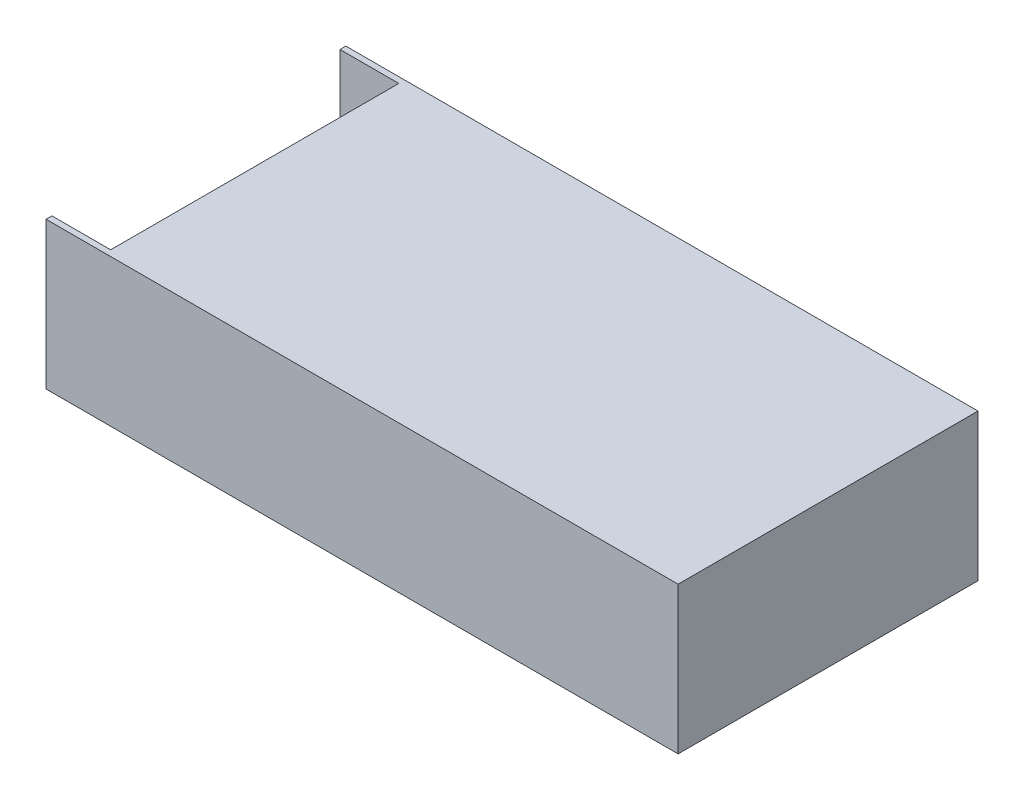
ISO-10303-21;
HEADER;
FILE_DESCRIPTION(('STEP AP214'),'2;1');
FILE_NAME('part.step','',(''),(''),'','','');
FILE_SCHEMA(('AUTOMOTIVE_DESIGN { 1 0 10303 214 1 1 1 1 }'));
ENDSEC;
DATA;
#1=APPLICATION_CONTEXT('core data for automotive mechanical design processes');
#2=APPLICATION_PROTOCOL_DEFINITION('international standard','automotive_design',2000,#1);
#3=PRODUCT_CONTEXT('',#1,'mechanical');
#4=PRODUCT('Part','Part','',(#3));
#5=PRODUCT_RELATED_PRODUCT_CATEGORY('part','',(#4));
#6=PRODUCT_DEFINITION_FORMATION('','',#4);
#7=PRODUCT_DEFINITION_CONTEXT('part definition',#1,'design');
#8=PRODUCT_DEFINITION('design','',#6,#7);
#9=PRODUCT_DEFINITION_SHAPE('','',#8);
#10=(LENGTH_UNIT() NAMED_UNIT(*) SI_UNIT(.MILLI.,.METRE.));
#11=(NAMED_UNIT(*) PLANE_ANGLE_UNIT() SI_UNIT($,.RADIAN.));
#12=(NAMED_UNIT(*) SI_UNIT($,.STERADIAN.) SOLID_ANGLE_UNIT());
#13=UNCERTAINTY_MEASURE_WITH_UNIT(LENGTH_MEASURE(1.E-05),#10,'distance_accuracy_value','');
#14=(GEOMETRIC_REPRESENTATION_CONTEXT(3) GLOBAL_UNCERTAINTY_ASSIGNED_CONTEXT((#13)) GLOBAL_UNIT_ASSIGNED_CONTEXT((#10,
#11,#12)) REPRESENTATION_CONTEXT('',''));
#15=CARTESIAN_POINT('',(0.,0.,0.));
#16=DIRECTION('',(0.,0.,1.));
#17=DIRECTION('',(1.,0.,0.));
#18=AXIS2_PLACEMENT_3D('',#15,#16,#17);
#19=CARTESIAN_POINT('',(0.,50.,0.));
#20=DIRECTION('',(1.,0.,0.));
#21=DIRECTION('',(0.,0.,-1.));
#22=AXIS2_PLACEMENT_3D('',#19,#20,#21);
#23=PLANE('',#22);
#24=DIRECTION('',(0.,0.,1.));
#25=VECTOR('',#24,1.);
#26=CARTESIAN_POINT('',(0.,25.,-100.));
#27=LINE('',#26,#25);
#28=CARTESIAN_POINT('',(0.,25.,-100.));
#29=VERTEX_POINT('',#28);
#30=CARTESIAN_POINT('',(0.,25.,-2.));
#31=VERTEX_POINT('',#30);
#32=EDGE_CURVE('E113',#29,#31,#27,.T.);
#33=ORIENTED_EDGE('',*,*,#32,.F.);
#34=DIRECTION('',(0.,1.,0.));
#35=VECTOR('',#34,1.);
#36=CARTESIAN_POINT('',(0.,25.,-100.));
#37=LINE('',#36,#35);
#38=CARTESIAN_POINT('',(0.,50.,-100.));
#39=VERTEX_POINT('',#38);
#40=EDGE_CURVE('E143',#29,#39,#37,.T.);
#41=ORIENTED_EDGE('',*,*,#40,.T.);
#42=DIRECTION('',(0.,0.,1.));
#43=VECTOR('',#42,1.);
#44=CARTESIAN_POINT('',(0.,50.,0.));
#45=LINE('',#44,#43);
#46=CARTESIAN_POINT('',(0.,50.,-102.));
#47=VERTEX_POINT('',#46);
#48=EDGE_CURVE('E131',#47,#39,#45,.T.);
#49=ORIENTED_EDGE('',*,*,#48,.F.);
#50=DIRECTION('',(0.,-1.,0.));
#51=VECTOR('',#50,1.);
#52=CARTESIAN_POINT('',(0.,50.,-102.));
#53=LINE('',#52,#51);
#54=CARTESIAN_POINT('',(0.,0.,-102.));
#55=VERTEX_POINT('',#54);
#56=EDGE_CURVE('E138',#47,#55,#53,.T.);
#57=ORIENTED_EDGE('',*,*,#56,.T.);
#58=DIRECTION('',(0.,0.,1.));
#59=VECTOR('',#58,1.);
#60=CARTESIAN_POINT('',(0.,0.,0.));
#61=LINE('',#60,#59);
#62=CARTESIAN_POINT('',(0.,0.,0.));
#63=VERTEX_POINT('',#62);
#64=EDGE_CURVE('E139',#55,#63,#61,.T.);
#65=ORIENTED_EDGE('',*,*,#64,.T.);
#66=DIRECTION('',(0.,-1.,0.));
#67=VECTOR('',#66,1.);
#68=CARTESIAN_POINT('',(0.,50.,0.));
#69=LINE('',#68,#67);
#70=CARTESIAN_POINT('',(0.,50.,0.));
#71=VERTEX_POINT('',#70);
#72=EDGE_CURVE('E11',#71,#63,#69,.T.);
#73=ORIENTED_EDGE('',*,*,#72,.F.);
#74=CARTESIAN_POINT('',(0.,50.,-2.));
#75=VERTEX_POINT('',#74);
#76=EDGE_CURVE('E83',#75,#71,#45,.T.);
#77=ORIENTED_EDGE('',*,*,#76,.F.);
#78=DIRECTION('',(0.,1.,0.));
#79=VECTOR('',#78,1.);
#80=CARTESIAN_POINT('',(0.,25.,-2.));
#81=LINE('',#80,#79);
#82=EDGE_CURVE('E47',#31,#75,#81,.T.);
#83=ORIENTED_EDGE('',*,*,#82,.F.);
#84=EDGE_LOOP('',(#33,#41,#49,#57,#65,#73,#77,#83));
#85=FACE_BOUND('',#84,.T.);
#86=ADVANCED_FACE('F33',(#85),#23,.F.);
#87=CARTESIAN_POINT('',(0.,50.,0.));
#88=DIRECTION('',(0.,0.,-1.));
#89=DIRECTION('',(-1.,0.,0.));
#90=AXIS2_PLACEMENT_3D('',#87,#88,#89);
#91=PLANE('',#90);
#92=DIRECTION('',(1.,0.,0.));
#93=VECTOR('',#92,1.);
#94=CARTESIAN_POINT('',(0.,0.,0.));
#95=LINE('',#94,#93);
#96=CARTESIAN_POINT('',(215.,0.,0.));
#97=VERTEX_POINT('',#96);
#98=EDGE_CURVE('E142',#63,#97,#95,.T.);
#99=ORIENTED_EDGE('',*,*,#98,.T.);
#100=DIRECTION('',(0.,-1.,0.));
#101=VECTOR('',#100,1.);
#102=CARTESIAN_POINT('',(215.,50.,0.));
#103=LINE('',#102,#101);
#104=CARTESIAN_POINT('',(215.,50.,0.));
#105=VERTEX_POINT('',#104);
#106=EDGE_CURVE('E40',#105,#97,#103,.T.);
#107=ORIENTED_EDGE('',*,*,#106,.F.);
#108=DIRECTION('',(1.,0.,0.));
#109=VECTOR('',#108,1.);
#110=CARTESIAN_POINT('',(0.,50.,0.));
#111=LINE('',#110,#109);
#112=EDGE_CURVE('E133',#71,#105,#111,.T.);
#113=ORIENTED_EDGE('',*,*,#112,.F.);
#114=ORIENTED_EDGE('',*,*,#72,.T.);
#115=EDGE_LOOP('',(#99,#107,#113,#114));
#116=FACE_BOUND('',#115,.T.);
#117=ADVANCED_FACE('F171',(#116),#91,.F.);
#118=CARTESIAN_POINT('',(215.,50.,0.));
#119=DIRECTION('',(-1.,0.,0.));
#120=DIRECTION('',(0.,0.,1.));
#121=AXIS2_PLACEMENT_3D('',#118,#119,#120);
#122=PLANE('',#121);
#123=DIRECTION('',(0.,0.,-1.));
#124=VECTOR('',#123,1.);
#125=CARTESIAN_POINT('',(215.,0.,0.));
#126=LINE('',#125,#124);
#127=CARTESIAN_POINT('',(215.,0.,-102.));
#128=VERTEX_POINT('',#127);
#129=EDGE_CURVE('E145',#97,#128,#126,.T.);
#130=ORIENTED_EDGE('',*,*,#129,.T.);
#131=DIRECTION('',(0.,-1.,0.));
#132=VECTOR('',#131,1.);
#133=CARTESIAN_POINT('',(215.,50.,-102.));
#134=LINE('',#133,#132);
#135=CARTESIAN_POINT('',(215.,50.,-102.));
#136=VERTEX_POINT('',#135);
#137=EDGE_CURVE('E149',#136,#128,#134,.T.);
#138=ORIENTED_EDGE('',*,*,#137,.F.);
#139=DIRECTION('',(0.,0.,-1.));
#140=VECTOR('',#139,1.);
#141=CARTESIAN_POINT('',(215.,50.,0.));
#142=LINE('',#141,#140);
#143=EDGE_CURVE('E135',#105,#136,#142,.T.);
#144=ORIENTED_EDGE('',*,*,#143,.F.);
#145=ORIENTED_EDGE('',*,*,#106,.T.);
#146=EDGE_LOOP('',(#130,#138,#144,#145));
#147=FACE_BOUND('',#146,.T.);
#148=ADVANCED_FACE('F155',(#147),#122,.F.);
#149=CARTESIAN_POINT('',(0.,50.,-102.));
#150=DIRECTION('',(0.,0.,1.));
#151=DIRECTION('',(1.,0.,0.));
#152=AXIS2_PLACEMENT_3D('',#149,#150,#151);
#153=PLANE('',#152);
#154=DIRECTION('',(-1.,0.,0.));
#155=VECTOR('',#154,1.);
#156=CARTESIAN_POINT('',(0.,0.,-102.));
#157=LINE('',#156,#155);
#158=EDGE_CURVE('E77',#128,#55,#157,.T.);
#159=ORIENTED_EDGE('',*,*,#158,.T.);
#160=ORIENTED_EDGE('',*,*,#56,.F.);
#161=DIRECTION('',(-1.,0.,0.));
#162=VECTOR('',#161,1.);
#163=CARTESIAN_POINT('',(0.,50.,-102.));
#164=LINE('',#163,#162);
#165=EDGE_CURVE('E56',#136,#47,#164,.T.);
#166=ORIENTED_EDGE('',*,*,#165,.F.);
#167=ORIENTED_EDGE('',*,*,#137,.T.);
#168=EDGE_LOOP('',(#159,#160,#166,#167));
#169=FACE_BOUND('',#168,.T.);
#170=ADVANCED_FACE('F162',(#169),#153,.F.);
#171=CARTESIAN_POINT('',(0.,50.,0.));
#172=DIRECTION('',(0.,-1.,0.));
#173=DIRECTION('',(0.,0.,-1.));
#174=AXIS2_PLACEMENT_3D('',#171,#172,#173);
#175=PLANE('',#174);
#176=ORIENTED_EDGE('',*,*,#48,.T.);
#177=DIRECTION('',(-1.,0.,0.));
#178=VECTOR('',#177,1.);
#179=CARTESIAN_POINT('',(0.,50.,-100.));
#180=LINE('',#179,#178);
#181=CARTESIAN_POINT('',(20.,50.,-100.));
#182=VERTEX_POINT('',#181);
#183=EDGE_CURVE('E122',#182,#39,#180,.T.);
#184=ORIENTED_EDGE('',*,*,#183,.F.);
#185=DIRECTION('',(0.,0.,-1.));
#186=VECTOR('',#185,1.);
#187=CARTESIAN_POINT('',(20.,50.,-100.));
#188=LINE('',#187,#186);
#189=CARTESIAN_POINT('',(20.,50.,-2.));
#190=VERTEX_POINT('',#189);
#191=EDGE_CURVE('E183',#190,#182,#188,.T.);
#192=ORIENTED_EDGE('',*,*,#191,.F.);
#193=DIRECTION('',(1.,0.,0.));
#194=VECTOR('',#193,1.);
#195=CARTESIAN_POINT('',(0.,50.,-2.));
#196=LINE('',#195,#194);
#197=EDGE_CURVE('E186',#75,#190,#196,.T.);
#198=ORIENTED_EDGE('',*,*,#197,.F.);
#199=ORIENTED_EDGE('',*,*,#76,.T.);
#200=ORIENTED_EDGE('',*,*,#112,.T.);
#201=ORIENTED_EDGE('',*,*,#143,.T.);
#202=ORIENTED_EDGE('',*,*,#165,.T.);
#203=EDGE_LOOP('',(#176,#184,#192,#198,#199,#200,#201,#202));
#204=FACE_BOUND('',#203,.T.);
#205=ADVANCED_FACE('F164',(#204),#175,.F.);
#206=CARTESIAN_POINT('',(0.,0.,0.));
#207=DIRECTION('',(0.,-1.,0.));
#208=DIRECTION('',(0.,0.,-1.));
#209=AXIS2_PLACEMENT_3D('',#206,#207,#208);
#210=PLANE('',#209);
#211=ORIENTED_EDGE('',*,*,#64,.F.);
#212=ORIENTED_EDGE('',*,*,#158,.F.);
#213=ORIENTED_EDGE('',*,*,#129,.F.);
#214=ORIENTED_EDGE('',*,*,#98,.F.);
#215=EDGE_LOOP('',(#211,#212,#213,#214));
#216=FACE_BOUND('',#215,.T.);
#217=ADVANCED_FACE('F160',(#216),#210,.T.);
#218=CARTESIAN_POINT('',(0.,25.,-100.));
#219=DIRECTION('',(0.,0.,-1.));
#220=DIRECTION('',(-1.,0.,0.));
#221=AXIS2_PLACEMENT_3D('',#218,#219,#220);
#222=PLANE('',#221);
#223=ORIENTED_EDGE('',*,*,#183,.T.);
#224=ORIENTED_EDGE('',*,*,#40,.F.);
#225=DIRECTION('',(-1.,0.,0.));
#226=VECTOR('',#225,1.);
#227=CARTESIAN_POINT('',(0.,25.,-100.));
#228=LINE('',#227,#226);
#229=CARTESIAN_POINT('',(20.,25.,-100.));
#230=VERTEX_POINT('',#229);
#231=EDGE_CURVE('E119',#230,#29,#228,.T.);
#232=ORIENTED_EDGE('',*,*,#231,.F.);
#233=DIRECTION('',(0.,1.,0.));
#234=VECTOR('',#233,1.);
#235=CARTESIAN_POINT('',(20.,25.,-100.));
#236=LINE('',#235,#234);
#237=EDGE_CURVE('E126',#230,#182,#236,.T.);
#238=ORIENTED_EDGE('',*,*,#237,.T.);
#239=EDGE_LOOP('',(#223,#224,#232,#238));
#240=FACE_BOUND('',#239,.T.);
#241=ADVANCED_FACE('F190',(#240),#222,.F.);
#242=CARTESIAN_POINT('',(20.,25.,-100.));
#243=DIRECTION('',(1.,0.,0.));
#244=DIRECTION('',(0.,0.,-1.));
#245=AXIS2_PLACEMENT_3D('',#242,#243,#244);
#246=PLANE('',#245);
#247=ORIENTED_EDGE('',*,*,#191,.T.);
#248=ORIENTED_EDGE('',*,*,#237,.F.);
#249=DIRECTION('',(0.,0.,-1.));
#250=VECTOR('',#249,1.);
#251=CARTESIAN_POINT('',(20.,25.,-100.));
#252=LINE('',#251,#250);
#253=CARTESIAN_POINT('',(20.,25.,-2.));
#254=VERTEX_POINT('',#253);
#255=EDGE_CURVE('E112',#254,#230,#252,.T.);
#256=ORIENTED_EDGE('',*,*,#255,.F.);
#257=DIRECTION('',(0.,1.,0.));
#258=VECTOR('',#257,1.);
#259=CARTESIAN_POINT('',(20.,25.,-2.));
#260=LINE('',#259,#258);
#261=EDGE_CURVE('E108',#254,#190,#260,.T.);
#262=ORIENTED_EDGE('',*,*,#261,.T.);
#263=EDGE_LOOP('',(#247,#248,#256,#262));
#264=FACE_BOUND('',#263,.T.);
#265=ADVANCED_FACE('F192',(#264),#246,.F.);
#266=CARTESIAN_POINT('',(0.,25.,-2.));
#267=DIRECTION('',(0.,0.,1.));
#268=DIRECTION('',(1.,0.,0.));
#269=AXIS2_PLACEMENT_3D('',#266,#267,#268);
#270=PLANE('',#269);
#271=ORIENTED_EDGE('',*,*,#197,.T.);
#272=ORIENTED_EDGE('',*,*,#261,.F.);
#273=DIRECTION('',(1.,0.,0.));
#274=VECTOR('',#273,1.);
#275=CARTESIAN_POINT('',(0.,25.,-2.));
#276=LINE('',#275,#274);
#277=EDGE_CURVE('E105',#31,#254,#276,.T.);
#278=ORIENTED_EDGE('',*,*,#277,.F.);
#279=ORIENTED_EDGE('',*,*,#82,.T.);
#280=EDGE_LOOP('',(#271,#272,#278,#279));
#281=FACE_BOUND('',#280,.T.);
#282=ADVANCED_FACE('F107',(#281),#270,.F.);
#283=CARTESIAN_POINT('',(0.,25.,0.));
#284=DIRECTION('',(0.,1.,0.));
#285=DIRECTION('',(0.,0.,1.));
#286=AXIS2_PLACEMENT_3D('',#283,#284,#285);
#287=PLANE('',#286);
#288=ORIENTED_EDGE('',*,*,#32,.T.);
#289=ORIENTED_EDGE('',*,*,#277,.T.);
#290=ORIENTED_EDGE('',*,*,#255,.T.);
#291=ORIENTED_EDGE('',*,*,#231,.T.);
#292=EDGE_LOOP('',(#288,#289,#290,#291));
#293=FACE_BOUND('',#292,.T.);
#294=ADVANCED_FACE('F117',(#293),#287,.T.);
#295=CLOSED_SHELL('',(#86,#117,#148,#170,#205,#217,#241,#265,#282,#294));
#296=MANIFOLD_SOLID_BREP('B2',#295);
#297=ADVANCED_BREP_SHAPE_REPRESENTATION('',(#18,#296),#14);
#298=SHAPE_DEFINITION_REPRESENTATION(#9,#297);
ENDSEC;
END-ISO-10303-21;
